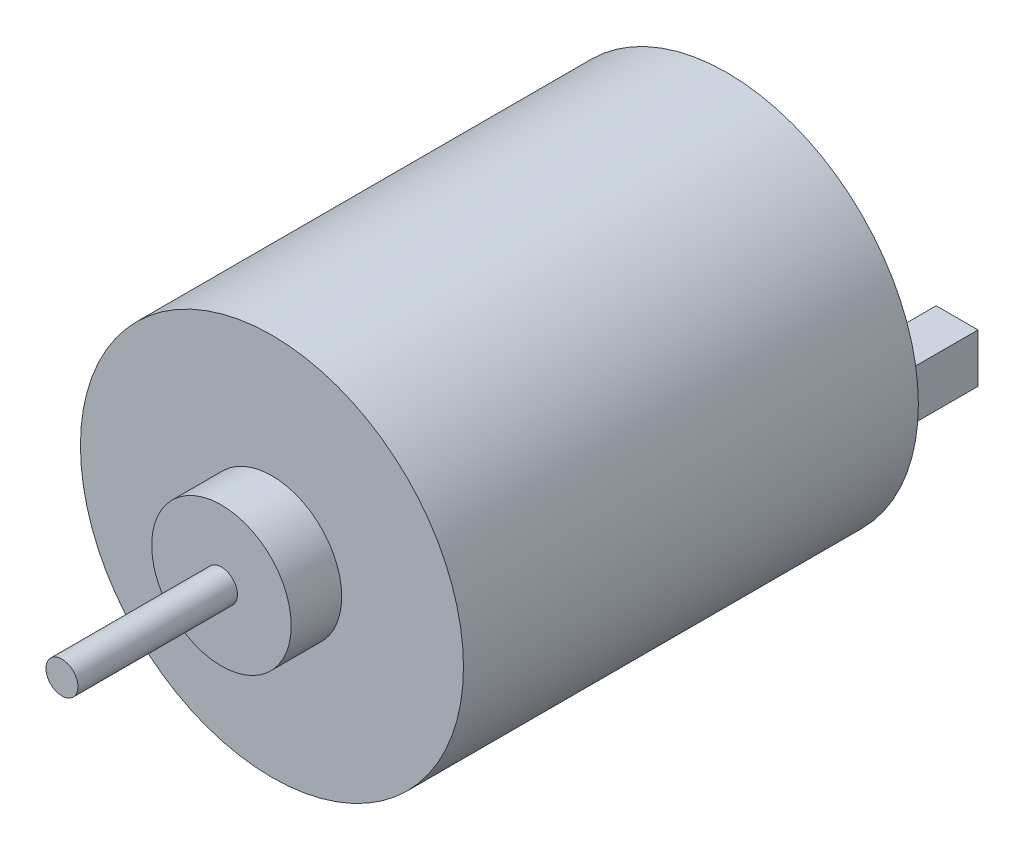
ISO-10303-21;
HEADER;
FILE_DESCRIPTION(('STEP AP214'),'2;1');
FILE_NAME('part.step','',(''),(''),'','','');
FILE_SCHEMA(('AUTOMOTIVE_DESIGN { 1 0 10303 214 1 1 1 1 }'));
ENDSEC;
DATA;
#1=APPLICATION_CONTEXT('core data for automotive mechanical design processes');
#2=APPLICATION_PROTOCOL_DEFINITION('international standard','automotive_design',2000,#1);
#3=PRODUCT_CONTEXT('',#1,'mechanical');
#4=PRODUCT('Part','Part','',(#3));
#5=PRODUCT_RELATED_PRODUCT_CATEGORY('part','',(#4));
#6=PRODUCT_DEFINITION_FORMATION('','',#4);
#7=PRODUCT_DEFINITION_CONTEXT('part definition',#1,'design');
#8=PRODUCT_DEFINITION('design','',#6,#7);
#9=PRODUCT_DEFINITION_SHAPE('','',#8);
#10=(LENGTH_UNIT() NAMED_UNIT(*) SI_UNIT(.MILLI.,.METRE.));
#11=(NAMED_UNIT(*) PLANE_ANGLE_UNIT() SI_UNIT($,.RADIAN.));
#12=(NAMED_UNIT(*) SI_UNIT($,.STERADIAN.) SOLID_ANGLE_UNIT());
#13=UNCERTAINTY_MEASURE_WITH_UNIT(LENGTH_MEASURE(1.E-05),#10,'distance_accuracy_value','');
#14=(GEOMETRIC_REPRESENTATION_CONTEXT(3) GLOBAL_UNCERTAINTY_ASSIGNED_CONTEXT((#13)) GLOBAL_UNIT_ASSIGNED_CONTEXT((#10,
#11,#12)) REPRESENTATION_CONTEXT('',''));
#15=CARTESIAN_POINT('',(0.,0.,0.));
#16=DIRECTION('',(0.,0.,1.));
#17=DIRECTION('',(1.,0.,0.));
#18=AXIS2_PLACEMENT_3D('',#15,#16,#17);
#19=CARTESIAN_POINT('',(0.,0.,0.));
#20=DIRECTION('',(0.,0.,1.));
#21=DIRECTION('',(1.,0.,0.));
#22=AXIS2_PLACEMENT_3D('',#19,#20,#21);
#23=PLANE('',#22);
#24=DIRECTION('',(0.,1.,0.));
#25=VECTOR('',#24,1.);
#26=CARTESIAN_POINT('',(10.,1.75,0.));
#27=LINE('',#26,#25);
#28=CARTESIAN_POINT('',(10.,-1.75,0.));
#29=VERTEX_POINT('',#28);
#30=CARTESIAN_POINT('',(10.,1.75,0.));
#31=VERTEX_POINT('',#30);
#32=EDGE_CURVE('E119',#29,#31,#27,.T.);
#33=ORIENTED_EDGE('',*,*,#32,.F.);
#34=DIRECTION('',(-1.,0.,0.));
#35=VECTOR('',#34,1.);
#36=CARTESIAN_POINT('',(13.,-1.75,0.));
#37=LINE('',#36,#35);
#38=CARTESIAN_POINT('',(13.,-1.75,0.));
#39=VERTEX_POINT('',#38);
#40=EDGE_CURVE('E132',#39,#29,#37,.T.);
#41=ORIENTED_EDGE('',*,*,#40,.F.);
#42=DIRECTION('',(0.,-1.,0.));
#43=VECTOR('',#42,1.);
#44=CARTESIAN_POINT('',(13.,1.75,0.));
#45=LINE('',#44,#43);
#46=CARTESIAN_POINT('',(13.,1.75,0.));
#47=VERTEX_POINT('',#46);
#48=EDGE_CURVE('E141',#47,#39,#45,.T.);
#49=ORIENTED_EDGE('',*,*,#48,.F.);
#50=DIRECTION('',(1.,0.,0.));
#51=VECTOR('',#50,1.);
#52=CARTESIAN_POINT('',(13.,1.75,0.));
#53=LINE('',#52,#51);
#54=EDGE_CURVE('E122',#31,#47,#53,.T.);
#55=ORIENTED_EDGE('',*,*,#54,.F.);
#56=EDGE_LOOP('',(#33,#41,#49,#55));
#57=FACE_BOUND('',#56,.T.);
#58=CARTESIAN_POINT('',(0.,0.,0.));
#59=DIRECTION('',(0.,0.,1.));
#60=DIRECTION('',(1.,0.,0.));
#61=AXIS2_PLACEMENT_3D('',#58,#59,#60);
#62=CIRCLE('',#61,5.);
#63=CARTESIAN_POINT('',(5.,0.,0.));
#64=VERTEX_POINT('',#63);
#65=EDGE_CURVE('E11',#64,#64,#62,.F.);
#66=ORIENTED_EDGE('',*,*,#65,.F.);
#67=EDGE_LOOP('',(#66));
#68=FACE_BOUND('',#67,.T.);
#69=CARTESIAN_POINT('',(0.,0.,0.));
#70=DIRECTION('',(0.,0.,1.));
#71=DIRECTION('',(1.,0.,0.));
#72=AXIS2_PLACEMENT_3D('',#69,#70,#71);
#73=CIRCLE('',#72,13.725);
#74=CARTESIAN_POINT('',(13.725,0.,0.));
#75=VERTEX_POINT('',#74);
#76=EDGE_CURVE('E176',#75,#75,#73,.T.);
#77=ORIENTED_EDGE('',*,*,#76,.F.);
#78=EDGE_LOOP('',(#77));
#79=FACE_BOUND('',#78,.T.);
#80=DIRECTION('',(0.,1.,0.));
#81=VECTOR('',#80,1.);
#82=CARTESIAN_POINT('',(-13.,1.75,0.));
#83=LINE('',#82,#81);
#84=CARTESIAN_POINT('',(-13.,-1.75,0.));
#85=VERTEX_POINT('',#84);
#86=CARTESIAN_POINT('',(-13.,1.75,0.));
#87=VERTEX_POINT('',#86);
#88=EDGE_CURVE('E118',#85,#87,#83,.T.);
#89=ORIENTED_EDGE('',*,*,#88,.F.);
#90=DIRECTION('',(-1.,0.,0.));
#91=VECTOR('',#90,1.);
#92=CARTESIAN_POINT('',(-10.,-1.75,0.));
#93=LINE('',#92,#91);
#94=CARTESIAN_POINT('',(-10.,-1.75,0.));
#95=VERTEX_POINT('',#94);
#96=EDGE_CURVE('E115',#95,#85,#93,.T.);
#97=ORIENTED_EDGE('',*,*,#96,.F.);
#98=DIRECTION('',(0.,-1.,0.));
#99=VECTOR('',#98,1.);
#100=CARTESIAN_POINT('',(-10.,1.75,0.));
#101=LINE('',#100,#99);
#102=CARTESIAN_POINT('',(-10.,1.75,0.));
#103=VERTEX_POINT('',#102);
#104=EDGE_CURVE('E53',#103,#95,#101,.T.);
#105=ORIENTED_EDGE('',*,*,#104,.F.);
#106=DIRECTION('',(1.,0.,0.));
#107=VECTOR('',#106,1.);
#108=CARTESIAN_POINT('',(-10.,1.75,0.));
#109=LINE('',#108,#107);
#110=EDGE_CURVE('E48',#87,#103,#109,.T.);
#111=ORIENTED_EDGE('',*,*,#110,.F.);
#112=EDGE_LOOP('',(#89,#97,#105,#111));
#113=FACE_BOUND('',#112,.T.);
#114=ADVANCED_FACE('F33',(#57,#68,#79,#113),#23,.F.);
#115=CARTESIAN_POINT('',(0.,0.,32.6));
#116=DIRECTION('',(0.,0.,-1.));
#117=DIRECTION('',(-1.,0.,0.));
#118=AXIS2_PLACEMENT_3D('',#115,#116,#117);
#119=CYLINDRICAL_SURFACE('',#118,13.725);
#120=CARTESIAN_POINT('',(0.,0.,32.6));
#121=DIRECTION('',(0.,0.,1.));
#122=DIRECTION('',(1.,0.,0.));
#123=AXIS2_PLACEMENT_3D('',#120,#121,#122);
#124=CIRCLE('',#123,13.725);
#125=CARTESIAN_POINT('',(13.725,0.,32.6));
#126=VERTEX_POINT('',#125);
#127=EDGE_CURVE('E41',#126,#126,#124,.T.);
#128=ORIENTED_EDGE('',*,*,#127,.F.);
#129=EDGE_LOOP('',(#128));
#130=FACE_BOUND('',#129,.T.);
#131=ORIENTED_EDGE('',*,*,#76,.T.);
#132=EDGE_LOOP('',(#131));
#133=FACE_BOUND('',#132,.T.);
#134=ADVANCED_FACE('F35',(#130,#133),#119,.T.);
#135=CARTESIAN_POINT('',(0.,0.,32.6));
#136=DIRECTION('',(0.,0.,1.));
#137=DIRECTION('',(1.,0.,0.));
#138=AXIS2_PLACEMENT_3D('',#135,#136,#137);
#139=PLANE('',#138);
#140=CARTESIAN_POINT('',(0.,0.,32.6));
#141=DIRECTION('',(0.,0.,1.));
#142=DIRECTION('',(1.,0.,0.));
#143=AXIS2_PLACEMENT_3D('',#140,#141,#142);
#144=CIRCLE('',#143,5.);
#145=CARTESIAN_POINT('',(5.,0.,32.6));
#146=VERTEX_POINT('',#145);
#147=EDGE_CURVE('E170',#146,#146,#144,.T.);
#148=ORIENTED_EDGE('',*,*,#147,.F.);
#149=EDGE_LOOP('',(#148));
#150=FACE_BOUND('',#149,.T.);
#151=ORIENTED_EDGE('',*,*,#127,.T.);
#152=EDGE_LOOP('',(#151));
#153=FACE_BOUND('',#152,.T.);
#154=ADVANCED_FACE('F264',(#150,#153),#139,.T.);
#155=CARTESIAN_POINT('',(0.,0.,36.22));
#156=DIRECTION('',(0.,0.,-1.));
#157=DIRECTION('',(-1.,0.,0.));
#158=AXIS2_PLACEMENT_3D('',#155,#156,#157);
#159=CYLINDRICAL_SURFACE('',#158,5.);
#160=CARTESIAN_POINT('',(0.,0.,36.22));
#161=DIRECTION('',(0.,0.,1.));
#162=DIRECTION('',(1.,0.,0.));
#163=AXIS2_PLACEMENT_3D('',#160,#161,#162);
#164=CIRCLE('',#163,5.);
#165=CARTESIAN_POINT('',(5.,0.,36.22));
#166=VERTEX_POINT('',#165);
#167=EDGE_CURVE('E173',#166,#166,#164,.T.);
#168=ORIENTED_EDGE('',*,*,#167,.F.);
#169=EDGE_LOOP('',(#168));
#170=FACE_BOUND('',#169,.T.);
#171=ORIENTED_EDGE('',*,*,#147,.T.);
#172=EDGE_LOOP('',(#171));
#173=FACE_BOUND('',#172,.T.);
#174=ADVANCED_FACE('F260',(#170,#173),#159,.T.);
#175=CARTESIAN_POINT('',(0.,0.,36.22));
#176=DIRECTION('',(0.,0.,1.));
#177=DIRECTION('',(1.,0.,0.));
#178=AXIS2_PLACEMENT_3D('',#175,#176,#177);
#179=PLANE('',#178);
#180=CARTESIAN_POINT('',(0.,0.,36.22));
#181=DIRECTION('',(0.,0.,1.));
#182=DIRECTION('',(1.,0.,0.));
#183=AXIS2_PLACEMENT_3D('',#180,#181,#182);
#184=CIRCLE('',#183,1.145);
#185=CARTESIAN_POINT('',(1.145,0.,36.22));
#186=VERTEX_POINT('',#185);
#187=EDGE_CURVE('E166',#186,#186,#184,.T.);
#188=ORIENTED_EDGE('',*,*,#187,.F.);
#189=EDGE_LOOP('',(#188));
#190=FACE_BOUND('',#189,.T.);
#191=ORIENTED_EDGE('',*,*,#167,.T.);
#192=EDGE_LOOP('',(#191));
#193=FACE_BOUND('',#192,.T.);
#194=ADVANCED_FACE('F256',(#190,#193),#179,.T.);
#195=CARTESIAN_POINT('',(0.,0.,47.65));
#196=DIRECTION('',(0.,0.,-1.));
#197=DIRECTION('',(-1.,0.,0.));
#198=AXIS2_PLACEMENT_3D('',#195,#196,#197);
#199=CYLINDRICAL_SURFACE('',#198,1.145);
#200=CARTESIAN_POINT('',(0.,0.,47.65));
#201=DIRECTION('',(0.,0.,1.));
#202=DIRECTION('',(1.,0.,0.));
#203=AXIS2_PLACEMENT_3D('',#200,#201,#202);
#204=CIRCLE('',#203,1.145);
#205=CARTESIAN_POINT('',(1.145,0.,47.65));
#206=VERTEX_POINT('',#205);
#207=EDGE_CURVE('E167',#206,#206,#204,.T.);
#208=ORIENTED_EDGE('',*,*,#207,.F.);
#209=EDGE_LOOP('',(#208));
#210=FACE_BOUND('',#209,.T.);
#211=ORIENTED_EDGE('',*,*,#187,.T.);
#212=EDGE_LOOP('',(#211));
#213=FACE_BOUND('',#212,.T.);
#214=ADVANCED_FACE('F252',(#210,#213),#199,.T.);
#215=CARTESIAN_POINT('',(0.,0.,47.65));
#216=DIRECTION('',(0.,0.,1.));
#217=DIRECTION('',(1.,0.,0.));
#218=AXIS2_PLACEMENT_3D('',#215,#216,#217);
#219=PLANE('',#218);
#220=ORIENTED_EDGE('',*,*,#207,.T.);
#221=EDGE_LOOP('',(#220));
#222=FACE_BOUND('',#221,.T.);
#223=ADVANCED_FACE('F248',(#222),#219,.T.);
#224=CARTESIAN_POINT('',(0.,0.,-2.15));
#225=DIRECTION('',(0.,0.,1.));
#226=DIRECTION('',(1.,0.,0.));
#227=AXIS2_PLACEMENT_3D('',#224,#225,#226);
#228=CYLINDRICAL_SURFACE('',#227,5.);
#229=CARTESIAN_POINT('',(0.,0.,-2.15));
#230=DIRECTION('',(0.,0.,-1.));
#231=DIRECTION('',(-1.,0.,0.));
#232=AXIS2_PLACEMENT_3D('',#229,#230,#231);
#233=CIRCLE('',#232,5.);
#234=CARTESIAN_POINT('',(5.,0.,-2.15));
#235=VERTEX_POINT('',#234);
#236=EDGE_CURVE('E161',#235,#235,#233,.T.);
#237=CARTESIAN_POINT('',(5.,0.,-2.15));
#238=CARTESIAN_POINT('',(5.,0.,-2.12760416666667));
#239=CARTESIAN_POINT('',(5.,0.,-2.10520833333333));
#240=CARTESIAN_POINT('',(5.,0.,-2.06041666666667));
#241=CARTESIAN_POINT('',(5.,0.,-2.03802083333333));
#242=CARTESIAN_POINT('',(5.,0.,-1.99322916666667));
#243=CARTESIAN_POINT('',(5.,0.,-1.97083333333333));
#244=CARTESIAN_POINT('',(5.,0.,-1.92604166666667));
#245=CARTESIAN_POINT('',(5.,0.,-1.90364583333333));
#246=CARTESIAN_POINT('',(5.,0.,-1.85885416666667));
#247=CARTESIAN_POINT('',(5.,0.,-1.83645833333333));
#248=CARTESIAN_POINT('',(5.,0.,-1.79166666666667));
#249=CARTESIAN_POINT('',(5.,0.,-1.76927083333333));
#250=CARTESIAN_POINT('',(5.,0.,-1.72447916666667));
#251=CARTESIAN_POINT('',(5.,0.,-1.70208333333333));
#252=CARTESIAN_POINT('',(5.,0.,-1.65729166666667));
#253=CARTESIAN_POINT('',(5.,0.,-1.63489583333333));
#254=CARTESIAN_POINT('',(5.,0.,-1.59010416666667));
#255=CARTESIAN_POINT('',(5.,0.,-1.56770833333333));
#256=CARTESIAN_POINT('',(5.,0.,-1.52291666666667));
#257=CARTESIAN_POINT('',(5.,0.,-1.50052083333333));
#258=CARTESIAN_POINT('',(5.,0.,-1.45572916666667));
#259=CARTESIAN_POINT('',(5.,0.,-1.43333333333333));
#260=CARTESIAN_POINT('',(5.,0.,-1.38854166666667));
#261=CARTESIAN_POINT('',(5.,0.,-1.36614583333333));
#262=CARTESIAN_POINT('',(5.,0.,-1.32135416666667));
#263=CARTESIAN_POINT('',(5.,0.,-1.29895833333333));
#264=CARTESIAN_POINT('',(5.,0.,-1.25416666666667));
#265=CARTESIAN_POINT('',(5.,0.,-1.23177083333333));
#266=CARTESIAN_POINT('',(5.,0.,-1.18697916666667));
#267=CARTESIAN_POINT('',(5.,0.,-1.16458333333333));
#268=CARTESIAN_POINT('',(5.,0.,-1.11979166666667));
#269=CARTESIAN_POINT('',(5.,0.,-1.09739583333333));
#270=CARTESIAN_POINT('',(5.,0.,-1.05260416666667));
#271=CARTESIAN_POINT('',(5.,0.,-1.03020833333333));
#272=CARTESIAN_POINT('',(5.,0.,-0.985416666666667));
#273=CARTESIAN_POINT('',(5.,0.,-0.963020833333334));
#274=CARTESIAN_POINT('',(5.,0.,-0.918229166666667));
#275=CARTESIAN_POINT('',(5.,0.,-0.895833333333334));
#276=CARTESIAN_POINT('',(5.,0.,-0.851041666666667));
#277=CARTESIAN_POINT('',(5.,0.,-0.828645833333334));
#278=CARTESIAN_POINT('',(5.,0.,-0.783854166666667));
#279=CARTESIAN_POINT('',(5.,0.,-0.761458333333334));
#280=CARTESIAN_POINT('',(5.,0.,-0.716666666666667));
#281=CARTESIAN_POINT('',(5.,0.,-0.694270833333334));
#282=CARTESIAN_POINT('',(5.,0.,-0.649479166666667));
#283=CARTESIAN_POINT('',(5.,0.,-0.627083333333334));
#284=CARTESIAN_POINT('',(5.,0.,-0.582291666666667));
#285=CARTESIAN_POINT('',(5.,0.,-0.559895833333334));
#286=CARTESIAN_POINT('',(5.,0.,-0.515104166666667));
#287=CARTESIAN_POINT('',(5.,0.,-0.492708333333334));
#288=CARTESIAN_POINT('',(5.,0.,-0.447916666666667));
#289=CARTESIAN_POINT('',(5.,0.,-0.425520833333334));
#290=CARTESIAN_POINT('',(5.,0.,-0.380729166666667));
#291=CARTESIAN_POINT('',(5.,0.,-0.358333333333334));
#292=CARTESIAN_POINT('',(5.,0.,-0.313541666666667));
#293=CARTESIAN_POINT('',(5.,0.,-0.291145833333334));
#294=CARTESIAN_POINT('',(5.,0.,-0.246354166666667));
#295=CARTESIAN_POINT('',(5.,0.,-0.223958333333334));
#296=CARTESIAN_POINT('',(5.,0.,-0.179166666666667));
#297=CARTESIAN_POINT('',(5.,0.,-0.156770833333334));
#298=CARTESIAN_POINT('',(5.,0.,-0.111979166666667));
#299=CARTESIAN_POINT('',(5.,0.,-0.0895833333333337));
#300=CARTESIAN_POINT('',(5.,0.,-0.0447916666666671));
#301=CARTESIAN_POINT('',(5.,0.,-0.0223958333333338));
#302=CARTESIAN_POINT('',(5.,0.,0.));
#303=B_SPLINE_CURVE_WITH_KNOTS('',3,(#237,#238,#239,#240,#241,#242,#243,#244,#245,#246,#247,
#248,#249,#250,#251,#252,#253,#254,#255,#256,#257,#258,#259,#260,#261,#262,#263,#264,#265,#266,
#267,#268,#269,#270,#271,#272,#273,#274,#275,#276,#277,#278,#279,#280,#281,#282,#283,#284,#285,
#286,#287,#288,#289,#290,#291,#292,#293,#294,#295,#296,#297,#298,#299,#300,#301,#302),
.UNSPECIFIED.,.F.,.F.,(4,2,2,2,2,2,2,2,2,2,2,2,2,2,2,2,2,2,2,2,2,2,2,2,2,2,2,2,2,2,2,2,4),(0.,
0.0671875,0.134375,0.2015625,0.26875,0.3359375,0.403125,0.4703125,0.5375,0.604687499999999,
0.671875,0.7390625,0.80625,0.8734375,0.940625,1.0078125,1.075,1.1421875,1.209375,1.2765625,
1.34375,1.4109375,1.478125,1.5453125,1.6125,1.6796875,1.746875,1.8140625,1.88125,1.9484375,
2.015625,2.0828125,2.15),.UNSPECIFIED.);
#304=EDGE_CURVE('BSEAM244',#235,#64,#303,.T.);
#305=ORIENTED_EDGE('',*,*,#236,.F.);
#306=ORIENTED_EDGE('',*,*,#65,.T.);
#307=ORIENTED_EDGE('',*,*,#304,.T.);
#308=ORIENTED_EDGE('',*,*,#304,.F.);
#309=EDGE_LOOP('',(#305,#307,#306,#308));
#310=FACE_BOUND('',#309,.T.);
#311=ADVANCED_FACE('F244',(#310),#228,.T.);
#312=CARTESIAN_POINT('',(0.,0.,-2.15));
#313=DIRECTION('',(0.,0.,-1.));
#314=DIRECTION('',(-1.,0.,0.));
#315=AXIS2_PLACEMENT_3D('',#312,#313,#314);
#316=PLANE('',#315);
#317=CARTESIAN_POINT('',(0.,0.,-2.15));
#318=DIRECTION('',(0.,0.,-1.));
#319=DIRECTION('',(-1.,0.,0.));
#320=AXIS2_PLACEMENT_3D('',#317,#318,#319);
#321=CIRCLE('',#320,1.15);
#322=CARTESIAN_POINT('',(-1.15,0.,-2.15));
#323=VERTEX_POINT('',#322);
#324=EDGE_CURVE('E157',#323,#323,#321,.T.);
#325=ORIENTED_EDGE('',*,*,#324,.F.);
#326=EDGE_LOOP('',(#325));
#327=FACE_BOUND('',#326,.T.);
#328=ORIENTED_EDGE('',*,*,#236,.T.);
#329=EDGE_LOOP('',(#328));
#330=FACE_BOUND('',#329,.T.);
#331=ADVANCED_FACE('F240',(#327,#330),#316,.T.);
#332=CARTESIAN_POINT('',(0.,0.,-3.15));
#333=DIRECTION('',(0.,0.,1.));
#334=DIRECTION('',(1.,0.,0.));
#335=AXIS2_PLACEMENT_3D('',#332,#333,#334);
#336=CYLINDRICAL_SURFACE('',#335,1.15);
#337=CARTESIAN_POINT('',(0.,0.,-3.15));
#338=DIRECTION('',(0.,0.,-1.));
#339=DIRECTION('',(-1.,0.,0.));
#340=AXIS2_PLACEMENT_3D('',#337,#338,#339);
#341=CIRCLE('',#340,1.15);
#342=CARTESIAN_POINT('',(-1.15,0.,-3.15));
#343=VERTEX_POINT('',#342);
#344=EDGE_CURVE('E158',#343,#343,#341,.T.);
#345=ORIENTED_EDGE('',*,*,#344,.F.);
#346=EDGE_LOOP('',(#345));
#347=FACE_BOUND('',#346,.T.);
#348=ORIENTED_EDGE('',*,*,#324,.T.);
#349=EDGE_LOOP('',(#348));
#350=FACE_BOUND('',#349,.T.);
#351=ADVANCED_FACE('F236',(#347,#350),#336,.T.);
#352=CARTESIAN_POINT('',(0.,0.,-3.15));
#353=DIRECTION('',(0.,0.,-1.));
#354=DIRECTION('',(-1.,0.,0.));
#355=AXIS2_PLACEMENT_3D('',#352,#353,#354);
#356=PLANE('',#355);
#357=ORIENTED_EDGE('',*,*,#344,.T.);
#358=EDGE_LOOP('',(#357));
#359=FACE_BOUND('',#358,.T.);
#360=ADVANCED_FACE('F232',(#359),#356,.T.);
#361=CARTESIAN_POINT('',(10.,1.75,-5.));
#362=DIRECTION('',(1.,0.,0.));
#363=DIRECTION('',(0.,0.,-1.));
#364=AXIS2_PLACEMENT_3D('',#361,#362,#363);
#365=PLANE('',#364);
#366=ORIENTED_EDGE('',*,*,#32,.T.);
#367=DIRECTION('',(0.,0.,1.));
#368=VECTOR('',#367,1.);
#369=CARTESIAN_POINT('',(10.,1.75,-5.));
#370=LINE('',#369,#368);
#371=CARTESIAN_POINT('',(10.,1.75,-5.));
#372=VERTEX_POINT('',#371);
#373=EDGE_CURVE('E154',#372,#31,#370,.T.);
#374=ORIENTED_EDGE('',*,*,#373,.F.);
#375=DIRECTION('',(0.,1.,0.));
#376=VECTOR('',#375,1.);
#377=CARTESIAN_POINT('',(10.,1.75,-5.));
#378=LINE('',#377,#376);
#379=CARTESIAN_POINT('',(10.,-1.75,-5.));
#380=VERTEX_POINT('',#379);
#381=EDGE_CURVE('E128',#380,#372,#378,.T.);
#382=ORIENTED_EDGE('',*,*,#381,.F.);
#383=DIRECTION('',(0.,0.,1.));
#384=VECTOR('',#383,1.);
#385=CARTESIAN_POINT('',(10.,-1.75,-5.));
#386=LINE('',#385,#384);
#387=EDGE_CURVE('E137',#380,#29,#386,.T.);
#388=ORIENTED_EDGE('',*,*,#387,.T.);
#389=EDGE_LOOP('',(#366,#374,#382,#388));
#390=FACE_BOUND('',#389,.T.);
#391=ADVANCED_FACE('F228',(#390),#365,.F.);
#392=CARTESIAN_POINT('',(13.,1.75,-5.));
#393=DIRECTION('',(0.,-1.,0.));
#394=DIRECTION('',(1.,0.,0.));
#395=AXIS2_PLACEMENT_3D('',#392,#393,#394);
#396=PLANE('',#395);
#397=ORIENTED_EDGE('',*,*,#54,.T.);
#398=DIRECTION('',(0.,0.,1.));
#399=VECTOR('',#398,1.);
#400=CARTESIAN_POINT('',(13.,1.75,-5.));
#401=LINE('',#400,#399);
#402=CARTESIAN_POINT('',(13.,1.75,-5.));
#403=VERTEX_POINT('',#402);
#404=EDGE_CURVE('E151',#403,#47,#401,.T.);
#405=ORIENTED_EDGE('',*,*,#404,.F.);
#406=DIRECTION('',(1.,0.,0.));
#407=VECTOR('',#406,1.);
#408=CARTESIAN_POINT('',(13.,1.75,-5.));
#409=LINE('',#408,#407);
#410=EDGE_CURVE('E131',#372,#403,#409,.T.);
#411=ORIENTED_EDGE('',*,*,#410,.F.);
#412=ORIENTED_EDGE('',*,*,#373,.T.);
#413=EDGE_LOOP('',(#397,#405,#411,#412));
#414=FACE_BOUND('',#413,.T.);
#415=ADVANCED_FACE('F224',(#414),#396,.F.);
#416=CARTESIAN_POINT('',(13.,1.75,-5.));
#417=DIRECTION('',(-1.,0.,0.));
#418=DIRECTION('',(0.,0.,1.));
#419=AXIS2_PLACEMENT_3D('',#416,#417,#418);
#420=PLANE('',#419);
#421=ORIENTED_EDGE('',*,*,#48,.T.);
#422=DIRECTION('',(0.,0.,1.));
#423=VECTOR('',#422,1.);
#424=CARTESIAN_POINT('',(13.,-1.75,-5.));
#425=LINE('',#424,#423);
#426=CARTESIAN_POINT('',(13.,-1.75,-5.));
#427=VERTEX_POINT('',#426);
#428=EDGE_CURVE('E148',#427,#39,#425,.T.);
#429=ORIENTED_EDGE('',*,*,#428,.F.);
#430=DIRECTION('',(0.,-1.,0.));
#431=VECTOR('',#430,1.);
#432=CARTESIAN_POINT('',(13.,1.75,-5.));
#433=LINE('',#432,#431);
#434=EDGE_CURVE('E134',#403,#427,#433,.T.);
#435=ORIENTED_EDGE('',*,*,#434,.F.);
#436=ORIENTED_EDGE('',*,*,#404,.T.);
#437=EDGE_LOOP('',(#421,#429,#435,#436));
#438=FACE_BOUND('',#437,.T.);
#439=ADVANCED_FACE('F220',(#438),#420,.F.);
#440=CARTESIAN_POINT('',(13.,-1.75,-5.));
#441=DIRECTION('',(0.,1.,0.));
#442=DIRECTION('',(-1.,0.,0.));
#443=AXIS2_PLACEMENT_3D('',#440,#441,#442);
#444=PLANE('',#443);
#445=ORIENTED_EDGE('',*,*,#40,.T.);
#446=ORIENTED_EDGE('',*,*,#387,.F.);
#447=DIRECTION('',(-1.,0.,0.));
#448=VECTOR('',#447,1.);
#449=CARTESIAN_POINT('',(13.,-1.75,-5.));
#450=LINE('',#449,#448);
#451=EDGE_CURVE('E136',#427,#380,#450,.T.);
#452=ORIENTED_EDGE('',*,*,#451,.F.);
#453=ORIENTED_EDGE('',*,*,#428,.T.);
#454=EDGE_LOOP('',(#445,#446,#452,#453));
#455=FACE_BOUND('',#454,.T.);
#456=ADVANCED_FACE('F216',(#455),#444,.F.);
#457=CARTESIAN_POINT('',(0.,0.,-5.));
#458=DIRECTION('',(0.,0.,-1.));
#459=DIRECTION('',(-1.,0.,0.));
#460=AXIS2_PLACEMENT_3D('',#457,#458,#459);
#461=PLANE('',#460);
#462=ORIENTED_EDGE('',*,*,#381,.T.);
#463=ORIENTED_EDGE('',*,*,#410,.T.);
#464=ORIENTED_EDGE('',*,*,#434,.T.);
#465=ORIENTED_EDGE('',*,*,#451,.T.);
#466=EDGE_LOOP('',(#462,#463,#464,#465));
#467=FACE_BOUND('',#466,.T.);
#468=ADVANCED_FACE('F213',(#467),#461,.T.);
#469=CARTESIAN_POINT('',(-13.,1.75,-5.));
#470=DIRECTION('',(1.,0.,0.));
#471=DIRECTION('',(0.,1.,0.));
#472=AXIS2_PLACEMENT_3D('',#469,#470,#471);
#473=PLANE('',#472);
#474=ORIENTED_EDGE('',*,*,#88,.T.);
#475=DIRECTION('',(0.,0.,1.));
#476=VECTOR('',#475,1.);
#477=CARTESIAN_POINT('',(-13.,1.75,-5.));
#478=LINE('',#477,#476);
#479=CARTESIAN_POINT('',(-13.,1.75,-5.));
#480=VERTEX_POINT('',#479);
#481=EDGE_CURVE('E99',#480,#87,#478,.T.);
#482=ORIENTED_EDGE('',*,*,#481,.F.);
#483=DIRECTION('',(0.,1.,0.));
#484=VECTOR('',#483,1.);
#485=CARTESIAN_POINT('',(-13.,1.75,-5.));
#486=LINE('',#485,#484);
#487=CARTESIAN_POINT('',(-13.,-1.75,-5.));
#488=VERTEX_POINT('',#487);
#489=EDGE_CURVE('E106',#488,#480,#486,.T.);
#490=ORIENTED_EDGE('',*,*,#489,.F.);
#491=DIRECTION('',(0.,0.,1.));
#492=VECTOR('',#491,1.);
#493=CARTESIAN_POINT('',(-13.,-1.75,-5.));
#494=LINE('',#493,#492);
#495=EDGE_CURVE('E191',#488,#85,#494,.T.);
#496=ORIENTED_EDGE('',*,*,#495,.T.);
#497=EDGE_LOOP('',(#474,#482,#490,#496));
#498=FACE_BOUND('',#497,.T.);
#499=ADVANCED_FACE('F117',(#498),#473,.F.);
#500=CARTESIAN_POINT('',(-10.,1.75,-5.));
#501=DIRECTION('',(0.,-1.,0.));
#502=DIRECTION('',(1.,0.,0.));
#503=AXIS2_PLACEMENT_3D('',#500,#501,#502);
#504=PLANE('',#503);
#505=ORIENTED_EDGE('',*,*,#110,.T.);
#506=DIRECTION('',(0.,0.,1.));
#507=VECTOR('',#506,1.);
#508=CARTESIAN_POINT('',(-10.,1.75,-5.));
#509=LINE('',#508,#507);
#510=CARTESIAN_POINT('',(-10.,1.75,-5.));
#511=VERTEX_POINT('',#510);
#512=EDGE_CURVE('E102',#511,#103,#509,.T.);
#513=ORIENTED_EDGE('',*,*,#512,.F.);
#514=DIRECTION('',(1.,0.,0.));
#515=VECTOR('',#514,1.);
#516=CARTESIAN_POINT('',(-10.,1.75,-5.));
#517=LINE('',#516,#515);
#518=EDGE_CURVE('E95',#480,#511,#517,.T.);
#519=ORIENTED_EDGE('',*,*,#518,.F.);
#520=ORIENTED_EDGE('',*,*,#481,.T.);
#521=EDGE_LOOP('',(#505,#513,#519,#520));
#522=FACE_BOUND('',#521,.T.);
#523=ADVANCED_FACE('F97',(#522),#504,.F.);
#524=CARTESIAN_POINT('',(-10.,1.75,-5.));
#525=DIRECTION('',(-1.,0.,0.));
#526=DIRECTION('',(0.,0.,1.));
#527=AXIS2_PLACEMENT_3D('',#524,#525,#526);
#528=PLANE('',#527);
#529=ORIENTED_EDGE('',*,*,#104,.T.);
#530=DIRECTION('',(0.,0.,1.));
#531=VECTOR('',#530,1.);
#532=CARTESIAN_POINT('',(-10.,-1.75,-5.));
#533=LINE('',#532,#531);
#534=CARTESIAN_POINT('',(-10.,-1.75,-5.));
#535=VERTEX_POINT('',#534);
#536=EDGE_CURVE('E124',#535,#95,#533,.T.);
#537=ORIENTED_EDGE('',*,*,#536,.F.);
#538=DIRECTION('',(0.,-1.,0.));
#539=VECTOR('',#538,1.);
#540=CARTESIAN_POINT('',(-10.,1.75,-5.));
#541=LINE('',#540,#539);
#542=EDGE_CURVE('E105',#511,#535,#541,.T.);
#543=ORIENTED_EDGE('',*,*,#542,.F.);
#544=ORIENTED_EDGE('',*,*,#512,.T.);
#545=EDGE_LOOP('',(#529,#537,#543,#544));
#546=FACE_BOUND('',#545,.T.);
#547=ADVANCED_FACE('F200',(#546),#528,.F.);
#548=CARTESIAN_POINT('',(-10.,-1.75,-5.));
#549=DIRECTION('',(0.,1.,0.));
#550=DIRECTION('',(-1.,0.,0.));
#551=AXIS2_PLACEMENT_3D('',#548,#549,#550);
#552=PLANE('',#551);
#553=ORIENTED_EDGE('',*,*,#96,.T.);
#554=ORIENTED_EDGE('',*,*,#495,.F.);
#555=DIRECTION('',(-1.,0.,0.));
#556=VECTOR('',#555,1.);
#557=CARTESIAN_POINT('',(-10.,-1.75,-5.));
#558=LINE('',#557,#556);
#559=EDGE_CURVE('E111',#535,#488,#558,.T.);
#560=ORIENTED_EDGE('',*,*,#559,.F.);
#561=ORIENTED_EDGE('',*,*,#536,.T.);
#562=EDGE_LOOP('',(#553,#554,#560,#561));
#563=FACE_BOUND('',#562,.T.);
#564=ADVANCED_FACE('F190',(#563),#552,.F.);
#565=CARTESIAN_POINT('',(0.,0.,-5.));
#566=DIRECTION('',(0.,0.,-1.));
#567=DIRECTION('',(-1.,0.,0.));
#568=AXIS2_PLACEMENT_3D('',#565,#566,#567);
#569=PLANE('',#568);
#570=ORIENTED_EDGE('',*,*,#489,.T.);
#571=ORIENTED_EDGE('',*,*,#518,.T.);
#572=ORIENTED_EDGE('',*,*,#542,.T.);
#573=ORIENTED_EDGE('',*,*,#559,.T.);
#574=EDGE_LOOP('',(#570,#571,#572,#573));
#575=FACE_BOUND('',#574,.T.);
#576=ADVANCED_FACE('F109',(#575),#569,.T.);
#577=CLOSED_SHELL('',(#114,#134,#154,#174,#194,#214,#223,#311,#331,#351,#360,#391,#415,#439,
#456,#468,#499,#523,#547,#564,#576));
#578=MANIFOLD_SOLID_BREP('B2',#577);
#579=ADVANCED_BREP_SHAPE_REPRESENTATION('',(#18,#578),#14);
#580=SHAPE_DEFINITION_REPRESENTATION(#9,#579);
ENDSEC;
END-ISO-10303-21;
